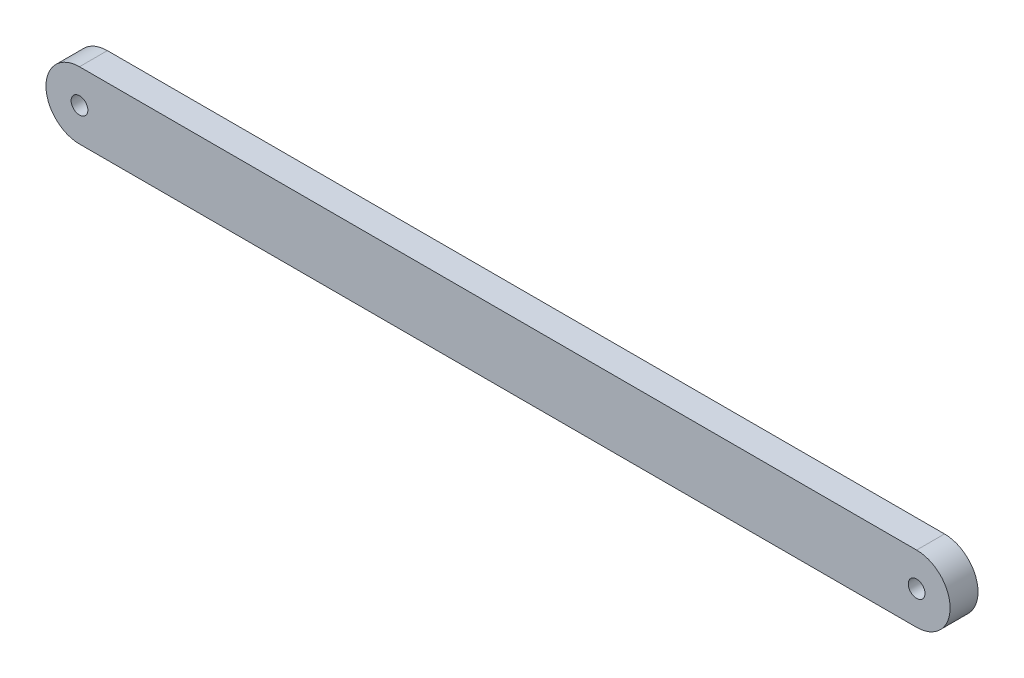
ISO-10303-21;
HEADER;
FILE_DESCRIPTION(('STEP AP214'),'2;1');
FILE_NAME('part.step','',(''),(''),'','','');
FILE_SCHEMA(('AUTOMOTIVE_DESIGN { 1 0 10303 214 1 1 1 1 }'));
ENDSEC;
DATA;
#1=APPLICATION_CONTEXT('core data for automotive mechanical design processes');
#2=APPLICATION_PROTOCOL_DEFINITION('international standard','automotive_design',2000,#1);
#3=PRODUCT_CONTEXT('',#1,'mechanical');
#4=PRODUCT('Part','Part','',(#3));
#5=PRODUCT_RELATED_PRODUCT_CATEGORY('part','',(#4));
#6=PRODUCT_DEFINITION_FORMATION('','',#4);
#7=PRODUCT_DEFINITION_CONTEXT('part definition',#1,'design');
#8=PRODUCT_DEFINITION('design','',#6,#7);
#9=PRODUCT_DEFINITION_SHAPE('','',#8);
#10=(LENGTH_UNIT() NAMED_UNIT(*) SI_UNIT(.MILLI.,.METRE.));
#11=(NAMED_UNIT(*) PLANE_ANGLE_UNIT() SI_UNIT($,.RADIAN.));
#12=(NAMED_UNIT(*) SI_UNIT($,.STERADIAN.) SOLID_ANGLE_UNIT());
#13=UNCERTAINTY_MEASURE_WITH_UNIT(LENGTH_MEASURE(1.E-05),#10,'distance_accuracy_value','');
#14=(GEOMETRIC_REPRESENTATION_CONTEXT(3) GLOBAL_UNCERTAINTY_ASSIGNED_CONTEXT((#13)) GLOBAL_UNIT_ASSIGNED_CONTEXT((#10,
#11,#12)) REPRESENTATION_CONTEXT('',''));
#15=CARTESIAN_POINT('',(0.,0.,0.));
#16=DIRECTION('',(0.,0.,1.));
#17=DIRECTION('',(1.,0.,0.));
#18=AXIS2_PLACEMENT_3D('',#15,#16,#17);
#19=CARTESIAN_POINT('',(-75.,0.,5.));
#20=DIRECTION('',(0.,0.,1.));
#21=DIRECTION('',(1.,0.,0.));
#22=AXIS2_PLACEMENT_3D('',#19,#20,#21);
#23=PLANE('',#22);
#24=CARTESIAN_POINT('',(-75.,0.,5.));
#25=DIRECTION('',(0.,0.,1.));
#26=DIRECTION('',(1.,0.,0.));
#27=AXIS2_PLACEMENT_3D('',#24,#25,#26);
#28=CIRCLE('',#27,1.5);
#29=CARTESIAN_POINT('',(-73.5,0.,5.));
#30=VERTEX_POINT('',#29);
#31=EDGE_CURVE('E102',#30,#30,#28,.T.);
#32=ORIENTED_EDGE('',*,*,#31,.F.);
#33=EDGE_LOOP('',(#32));
#34=FACE_BOUND('',#33,.T.);
#35=CARTESIAN_POINT('',(-75.,0.,5.));
#36=DIRECTION('',(0.,0.,1.));
#37=DIRECTION('',(1.,0.,0.));
#38=AXIS2_PLACEMENT_3D('',#35,#36,#37);
#39=CIRCLE('',#38,6.);
#40=CARTESIAN_POINT('',(-75.,6.,5.));
#41=VERTEX_POINT('',#40);
#42=CARTESIAN_POINT('',(-75.,-6.,5.));
#43=VERTEX_POINT('',#42);
#44=EDGE_CURVE('E87',#41,#43,#39,.T.);
#45=ORIENTED_EDGE('',*,*,#44,.T.);
#46=DIRECTION('',(1.,0.,0.));
#47=VECTOR('',#46,1.);
#48=CARTESIAN_POINT('',(-75.,-6.,5.));
#49=LINE('',#48,#47);
#50=CARTESIAN_POINT('',(75.,-6.,5.));
#51=VERTEX_POINT('',#50);
#52=EDGE_CURVE('E82',#43,#51,#49,.T.);
#53=ORIENTED_EDGE('',*,*,#52,.T.);
#54=CARTESIAN_POINT('',(75.,0.,5.));
#55=DIRECTION('',(0.,0.,1.));
#56=DIRECTION('',(1.,0.,0.));
#57=AXIS2_PLACEMENT_3D('',#54,#55,#56);
#58=CIRCLE('',#57,6.);
#59=CARTESIAN_POINT('',(75.,6.,5.));
#60=VERTEX_POINT('',#59);
#61=EDGE_CURVE('E85',#51,#60,#58,.T.);
#62=ORIENTED_EDGE('',*,*,#61,.T.);
#63=DIRECTION('',(-1.,0.,0.));
#64=VECTOR('',#63,1.);
#65=CARTESIAN_POINT('',(-75.,6.,5.));
#66=LINE('',#65,#64);
#67=EDGE_CURVE('E52',#60,#41,#66,.T.);
#68=ORIENTED_EDGE('',*,*,#67,.T.);
#69=EDGE_LOOP('',(#45,#53,#62,#68));
#70=FACE_BOUND('',#69,.T.);
#71=CARTESIAN_POINT('',(75.,0.,5.));
#72=DIRECTION('',(0.,0.,1.));
#73=DIRECTION('',(1.,0.,0.));
#74=AXIS2_PLACEMENT_3D('',#71,#72,#73);
#75=CIRCLE('',#74,1.5);
#76=CARTESIAN_POINT('',(76.5,0.,5.));
#77=VERTEX_POINT('',#76);
#78=EDGE_CURVE('E117',#77,#77,#75,.T.);
#79=ORIENTED_EDGE('',*,*,#78,.F.);
#80=EDGE_LOOP('',(#79));
#81=FACE_BOUND('',#80,.T.);
#82=ADVANCED_FACE('F35',(#34,#70,#81),#23,.T.);
#83=CARTESIAN_POINT('',(-75.,0.,0.));
#84=DIRECTION('',(0.,0.,1.));
#85=DIRECTION('',(1.,0.,0.));
#86=AXIS2_PLACEMENT_3D('',#83,#84,#85);
#87=PLANE('',#86);
#88=CARTESIAN_POINT('',(-75.,0.,0.));
#89=DIRECTION('',(0.,0.,1.));
#90=DIRECTION('',(1.,0.,0.));
#91=AXIS2_PLACEMENT_3D('',#88,#89,#90);
#92=CIRCLE('',#91,6.);
#93=CARTESIAN_POINT('',(-75.,6.,0.));
#94=VERTEX_POINT('',#93);
#95=CARTESIAN_POINT('',(-75.,-6.,0.));
#96=VERTEX_POINT('',#95);
#97=EDGE_CURVE('E99',#94,#96,#92,.T.);
#98=ORIENTED_EDGE('',*,*,#97,.F.);
#99=DIRECTION('',(-1.,0.,0.));
#100=VECTOR('',#99,1.);
#101=CARTESIAN_POINT('',(-75.,6.,0.));
#102=LINE('',#101,#100);
#103=CARTESIAN_POINT('',(75.,6.,0.));
#104=VERTEX_POINT('',#103);
#105=EDGE_CURVE('E75',#104,#94,#102,.T.);
#106=ORIENTED_EDGE('',*,*,#105,.F.);
#107=CARTESIAN_POINT('',(75.,0.,0.));
#108=DIRECTION('',(0.,0.,1.));
#109=DIRECTION('',(1.,0.,0.));
#110=AXIS2_PLACEMENT_3D('',#107,#108,#109);
#111=CIRCLE('',#110,6.);
#112=CARTESIAN_POINT('',(75.,-6.,0.));
#113=VERTEX_POINT('',#112);
#114=EDGE_CURVE('E69',#113,#104,#111,.T.);
#115=ORIENTED_EDGE('',*,*,#114,.F.);
#116=DIRECTION('',(1.,0.,0.));
#117=VECTOR('',#116,1.);
#118=CARTESIAN_POINT('',(-75.,-6.,0.));
#119=LINE('',#118,#117);
#120=EDGE_CURVE('E91',#96,#113,#119,.T.);
#121=ORIENTED_EDGE('',*,*,#120,.F.);
#122=EDGE_LOOP('',(#98,#106,#115,#121));
#123=FACE_BOUND('',#122,.T.);
#124=CARTESIAN_POINT('',(-75.,0.,0.));
#125=DIRECTION('',(0.,0.,1.));
#126=DIRECTION('',(1.,0.,0.));
#127=AXIS2_PLACEMENT_3D('',#124,#125,#126);
#128=CIRCLE('',#127,1.5);
#129=CARTESIAN_POINT('',(-73.5,0.,0.));
#130=VERTEX_POINT('',#129);
#131=EDGE_CURVE('E114',#130,#130,#128,.T.);
#132=ORIENTED_EDGE('',*,*,#131,.T.);
#133=EDGE_LOOP('',(#132));
#134=FACE_BOUND('',#133,.T.);
#135=CARTESIAN_POINT('',(75.,0.,0.));
#136=DIRECTION('',(0.,0.,1.));
#137=DIRECTION('',(1.,0.,0.));
#138=AXIS2_PLACEMENT_3D('',#135,#136,#137);
#139=CIRCLE('',#138,1.5);
#140=CARTESIAN_POINT('',(76.5,0.,0.));
#141=VERTEX_POINT('',#140);
#142=EDGE_CURVE('E120',#141,#141,#139,.T.);
#143=ORIENTED_EDGE('',*,*,#142,.T.);
#144=EDGE_LOOP('',(#143));
#145=FACE_BOUND('',#144,.T.);
#146=ADVANCED_FACE('F110',(#123,#134,#145),#87,.F.);
#147=CARTESIAN_POINT('',(-75.,0.,5.));
#148=DIRECTION('',(0.,0.,-1.));
#149=DIRECTION('',(-1.,0.,0.));
#150=AXIS2_PLACEMENT_3D('',#147,#148,#149);
#151=CYLINDRICAL_SURFACE('',#150,6.);
#152=ORIENTED_EDGE('',*,*,#97,.T.);
#153=DIRECTION('',(0.,0.,-1.));
#154=VECTOR('',#153,1.);
#155=CARTESIAN_POINT('',(-75.,-6.,5.));
#156=LINE('',#155,#154);
#157=EDGE_CURVE('E11',#43,#96,#156,.T.);
#158=ORIENTED_EDGE('',*,*,#157,.F.);
#159=ORIENTED_EDGE('',*,*,#44,.F.);
#160=DIRECTION('',(0.,0.,-1.));
#161=VECTOR('',#160,1.);
#162=CARTESIAN_POINT('',(-75.,6.,5.));
#163=LINE('',#162,#161);
#164=EDGE_CURVE('E95',#41,#94,#163,.T.);
#165=ORIENTED_EDGE('',*,*,#164,.T.);
#166=EDGE_LOOP('',(#152,#158,#159,#165));
#167=FACE_BOUND('',#166,.T.);
#168=ADVANCED_FACE('F37',(#167),#151,.T.);
#169=CARTESIAN_POINT('',(-75.,-6.,5.));
#170=DIRECTION('',(0.,1.,0.));
#171=DIRECTION('',(0.,0.,1.));
#172=AXIS2_PLACEMENT_3D('',#169,#170,#171);
#173=PLANE('',#172);
#174=ORIENTED_EDGE('',*,*,#120,.T.);
#175=DIRECTION('',(0.,0.,-1.));
#176=VECTOR('',#175,1.);
#177=CARTESIAN_POINT('',(75.,-6.,5.));
#178=LINE('',#177,#176);
#179=EDGE_CURVE('E44',#51,#113,#178,.T.);
#180=ORIENTED_EDGE('',*,*,#179,.F.);
#181=ORIENTED_EDGE('',*,*,#52,.F.);
#182=ORIENTED_EDGE('',*,*,#157,.T.);
#183=EDGE_LOOP('',(#174,#180,#181,#182));
#184=FACE_BOUND('',#183,.T.);
#185=ADVANCED_FACE('F90',(#184),#173,.F.);
#186=CARTESIAN_POINT('',(75.,0.,5.));
#187=DIRECTION('',(0.,0.,-1.));
#188=DIRECTION('',(-1.,0.,0.));
#189=AXIS2_PLACEMENT_3D('',#186,#187,#188);
#190=CYLINDRICAL_SURFACE('',#189,6.);
#191=ORIENTED_EDGE('',*,*,#114,.T.);
#192=DIRECTION('',(0.,0.,-1.));
#193=VECTOR('',#192,1.);
#194=CARTESIAN_POINT('',(75.,6.,5.));
#195=LINE('',#194,#193);
#196=EDGE_CURVE('E92',#60,#104,#195,.T.);
#197=ORIENTED_EDGE('',*,*,#196,.F.);
#198=ORIENTED_EDGE('',*,*,#61,.F.);
#199=ORIENTED_EDGE('',*,*,#179,.T.);
#200=EDGE_LOOP('',(#191,#197,#198,#199));
#201=FACE_BOUND('',#200,.T.);
#202=ADVANCED_FACE('F93',(#201),#190,.T.);
#203=CARTESIAN_POINT('',(-75.,6.,5.));
#204=DIRECTION('',(0.,-1.,0.));
#205=DIRECTION('',(0.,0.,-1.));
#206=AXIS2_PLACEMENT_3D('',#203,#204,#205);
#207=PLANE('',#206);
#208=ORIENTED_EDGE('',*,*,#105,.T.);
#209=ORIENTED_EDGE('',*,*,#164,.F.);
#210=ORIENTED_EDGE('',*,*,#67,.F.);
#211=ORIENTED_EDGE('',*,*,#196,.T.);
#212=EDGE_LOOP('',(#208,#209,#210,#211));
#213=FACE_BOUND('',#212,.T.);
#214=ADVANCED_FACE('F107',(#213),#207,.F.);
#215=CARTESIAN_POINT('',(-75.,0.,5.));
#216=DIRECTION('',(0.,0.,-1.));
#217=DIRECTION('',(-1.,0.,0.));
#218=AXIS2_PLACEMENT_3D('',#215,#216,#217);
#219=CYLINDRICAL_SURFACE('',#218,1.5);
#220=ORIENTED_EDGE('',*,*,#31,.T.);
#221=EDGE_LOOP('',(#220));
#222=FACE_BOUND('',#221,.T.);
#223=ORIENTED_EDGE('',*,*,#131,.F.);
#224=EDGE_LOOP('',(#223));
#225=FACE_BOUND('',#224,.T.);
#226=ADVANCED_FACE('F137',(#222,#225),#219,.F.);
#227=CARTESIAN_POINT('',(75.,0.,5.));
#228=DIRECTION('',(0.,0.,-1.));
#229=DIRECTION('',(-1.,0.,0.));
#230=AXIS2_PLACEMENT_3D('',#227,#228,#229);
#231=CYLINDRICAL_SURFACE('',#230,1.5);
#232=ORIENTED_EDGE('',*,*,#78,.T.);
#233=EDGE_LOOP('',(#232));
#234=FACE_BOUND('',#233,.T.);
#235=ORIENTED_EDGE('',*,*,#142,.F.);
#236=EDGE_LOOP('',(#235));
#237=FACE_BOUND('',#236,.T.);
#238=ADVANCED_FACE('F126',(#234,#237),#231,.F.);
#239=CLOSED_SHELL('',(#82,#146,#168,#185,#202,#214,#226,#238));
#240=MANIFOLD_SOLID_BREP('B2',#239);
#241=ADVANCED_BREP_SHAPE_REPRESENTATION('',(#18,#240),#14);
#242=SHAPE_DEFINITION_REPRESENTATION(#9,#241);
ENDSEC;
END-ISO-10303-21;
